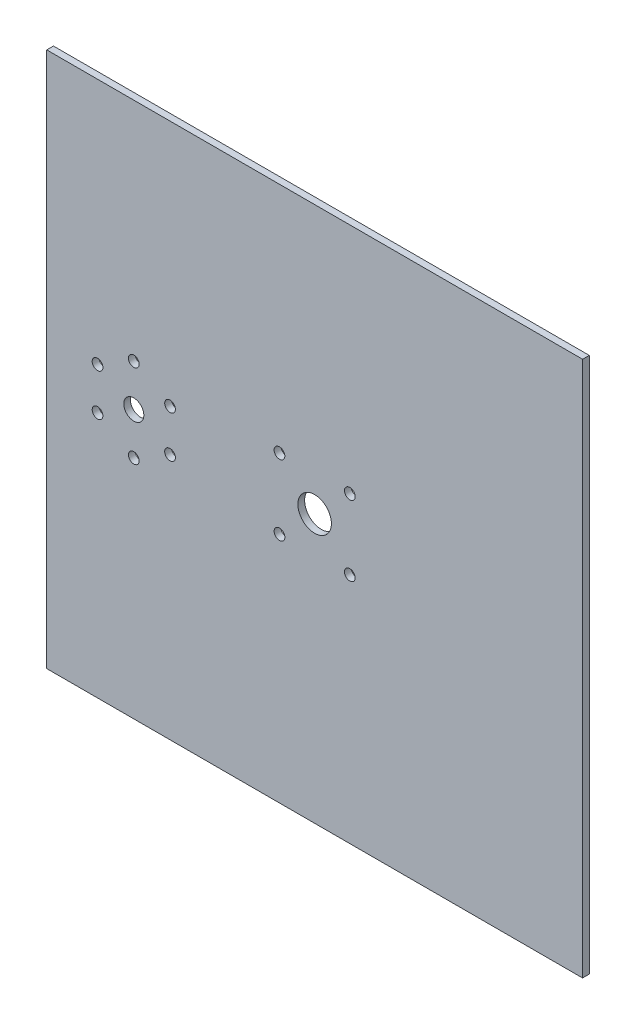
ISO-10303-21;
HEADER;
FILE_DESCRIPTION(('STEP AP214'),'2;1');
FILE_NAME('part.step','',(''),(''),'','','');
FILE_SCHEMA(('AUTOMOTIVE_DESIGN { 1 0 10303 214 1 1 1 1 }'));
ENDSEC;
DATA;
#1=APPLICATION_CONTEXT('core data for automotive mechanical design processes');
#2=APPLICATION_PROTOCOL_DEFINITION('international standard','automotive_design',2000,#1);
#3=PRODUCT_CONTEXT('',#1,'mechanical');
#4=PRODUCT('Part','Part','',(#3));
#5=PRODUCT_RELATED_PRODUCT_CATEGORY('part','',(#4));
#6=PRODUCT_DEFINITION_FORMATION('','',#4);
#7=PRODUCT_DEFINITION_CONTEXT('part definition',#1,'design');
#8=PRODUCT_DEFINITION('design','',#6,#7);
#9=PRODUCT_DEFINITION_SHAPE('','',#8);
#10=(LENGTH_UNIT() NAMED_UNIT(*) SI_UNIT(.MILLI.,.METRE.));
#11=(NAMED_UNIT(*) PLANE_ANGLE_UNIT() SI_UNIT($,.RADIAN.));
#12=(NAMED_UNIT(*) SI_UNIT($,.STERADIAN.) SOLID_ANGLE_UNIT());
#13=UNCERTAINTY_MEASURE_WITH_UNIT(LENGTH_MEASURE(1.E-05),#10,'distance_accuracy_value','');
#14=(GEOMETRIC_REPRESENTATION_CONTEXT(3) GLOBAL_UNCERTAINTY_ASSIGNED_CONTEXT((#13)) GLOBAL_UNIT_ASSIGNED_CONTEXT((#10,
#11,#12)) REPRESENTATION_CONTEXT('',''));
#15=CARTESIAN_POINT('',(0.,0.,0.));
#16=DIRECTION('',(0.,0.,1.));
#17=DIRECTION('',(1.,0.,0.));
#18=AXIS2_PLACEMENT_3D('',#15,#16,#17);
#19=CARTESIAN_POINT('',(-80.,80.,2.));
#20=DIRECTION('',(1.,0.,0.));
#21=DIRECTION('',(0.,0.,-1.));
#22=AXIS2_PLACEMENT_3D('',#19,#20,#21);
#23=PLANE('',#22);
#24=DIRECTION('',(0.,-1.,0.));
#25=VECTOR('',#24,1.);
#26=CARTESIAN_POINT('',(-80.,80.,0.));
#27=LINE('',#26,#25);
#28=CARTESIAN_POINT('',(-80.,80.,0.));
#29=VERTEX_POINT('',#28);
#30=CARTESIAN_POINT('',(-80.,-80.,0.));
#31=VERTEX_POINT('',#30);
#32=EDGE_CURVE('E97',#29,#31,#27,.T.);
#33=ORIENTED_EDGE('',*,*,#32,.T.);
#34=DIRECTION('',(0.,0.,-1.));
#35=VECTOR('',#34,1.);
#36=CARTESIAN_POINT('',(-80.,-80.,2.));
#37=LINE('',#36,#35);
#38=CARTESIAN_POINT('',(-80.,-80.,2.));
#39=VERTEX_POINT('',#38);
#40=EDGE_CURVE('E11',#39,#31,#37,.T.);
#41=ORIENTED_EDGE('',*,*,#40,.F.);
#42=DIRECTION('',(0.,-1.,0.));
#43=VECTOR('',#42,1.);
#44=CARTESIAN_POINT('',(-80.,80.,2.));
#45=LINE('',#44,#43);
#46=CARTESIAN_POINT('',(-80.,80.,2.));
#47=VERTEX_POINT('',#46);
#48=EDGE_CURVE('E85',#47,#39,#45,.T.);
#49=ORIENTED_EDGE('',*,*,#48,.F.);
#50=DIRECTION('',(0.,0.,-1.));
#51=VECTOR('',#50,1.);
#52=CARTESIAN_POINT('',(-80.,80.,2.));
#53=LINE('',#52,#51);
#54=EDGE_CURVE('E93',#47,#29,#53,.T.);
#55=ORIENTED_EDGE('',*,*,#54,.T.);
#56=EDGE_LOOP('',(#33,#41,#49,#55));
#57=FACE_BOUND('',#56,.T.);
#58=ADVANCED_FACE('F34',(#57),#23,.F.);
#59=CARTESIAN_POINT('',(-80.,-80.,2.));
#60=DIRECTION('',(0.,1.,0.));
#61=DIRECTION('',(0.,0.,1.));
#62=AXIS2_PLACEMENT_3D('',#59,#60,#61);
#63=PLANE('',#62);
#64=DIRECTION('',(1.,0.,0.));
#65=VECTOR('',#64,1.);
#66=CARTESIAN_POINT('',(-80.,-80.,0.));
#67=LINE('',#66,#65);
#68=CARTESIAN_POINT('',(80.,-80.,0.));
#69=VERTEX_POINT('',#68);
#70=EDGE_CURVE('E89',#31,#69,#67,.T.);
#71=ORIENTED_EDGE('',*,*,#70,.T.);
#72=DIRECTION('',(0.,0.,-1.));
#73=VECTOR('',#72,1.);
#74=CARTESIAN_POINT('',(80.,-80.,2.));
#75=LINE('',#74,#73);
#76=CARTESIAN_POINT('',(80.,-80.,2.));
#77=VERTEX_POINT('',#76);
#78=EDGE_CURVE('E42',#77,#69,#75,.T.);
#79=ORIENTED_EDGE('',*,*,#78,.F.);
#80=DIRECTION('',(1.,0.,0.));
#81=VECTOR('',#80,1.);
#82=CARTESIAN_POINT('',(-80.,-80.,2.));
#83=LINE('',#82,#81);
#84=EDGE_CURVE('E80',#39,#77,#83,.T.);
#85=ORIENTED_EDGE('',*,*,#84,.F.);
#86=ORIENTED_EDGE('',*,*,#40,.T.);
#87=EDGE_LOOP('',(#71,#79,#85,#86));
#88=FACE_BOUND('',#87,.T.);
#89=ADVANCED_FACE('F88',(#88),#63,.F.);
#90=CARTESIAN_POINT('',(80.,80.,2.));
#91=DIRECTION('',(-1.,0.,0.));
#92=DIRECTION('',(0.,0.,1.));
#93=AXIS2_PLACEMENT_3D('',#90,#91,#92);
#94=PLANE('',#93);
#95=DIRECTION('',(0.,1.,0.));
#96=VECTOR('',#95,1.);
#97=CARTESIAN_POINT('',(80.,80.,0.));
#98=LINE('',#97,#96);
#99=CARTESIAN_POINT('',(80.,80.,0.));
#100=VERTEX_POINT('',#99);
#101=EDGE_CURVE('E67',#69,#100,#98,.T.);
#102=ORIENTED_EDGE('',*,*,#101,.T.);
#103=DIRECTION('',(0.,0.,-1.));
#104=VECTOR('',#103,1.);
#105=CARTESIAN_POINT('',(80.,80.,2.));
#106=LINE('',#105,#104);
#107=CARTESIAN_POINT('',(80.,80.,2.));
#108=VERTEX_POINT('',#107);
#109=EDGE_CURVE('E90',#108,#100,#106,.T.);
#110=ORIENTED_EDGE('',*,*,#109,.F.);
#111=DIRECTION('',(0.,1.,0.));
#112=VECTOR('',#111,1.);
#113=CARTESIAN_POINT('',(80.,80.,2.));
#114=LINE('',#113,#112);
#115=EDGE_CURVE('E83',#77,#108,#114,.T.);
#116=ORIENTED_EDGE('',*,*,#115,.F.);
#117=ORIENTED_EDGE('',*,*,#78,.T.);
#118=EDGE_LOOP('',(#102,#110,#116,#117));
#119=FACE_BOUND('',#118,.T.);
#120=ADVANCED_FACE('F91',(#119),#94,.F.);
#121=CARTESIAN_POINT('',(-80.,80.,2.));
#122=DIRECTION('',(0.,-1.,0.));
#123=DIRECTION('',(0.,0.,-1.));
#124=AXIS2_PLACEMENT_3D('',#121,#122,#123);
#125=PLANE('',#124);
#126=DIRECTION('',(-1.,0.,0.));
#127=VECTOR('',#126,1.);
#128=CARTESIAN_POINT('',(-80.,80.,0.));
#129=LINE('',#128,#127);
#130=EDGE_CURVE('E73',#100,#29,#129,.T.);
#131=ORIENTED_EDGE('',*,*,#130,.T.);
#132=ORIENTED_EDGE('',*,*,#54,.F.);
#133=DIRECTION('',(-1.,0.,0.));
#134=VECTOR('',#133,1.);
#135=CARTESIAN_POINT('',(-80.,80.,2.));
#136=LINE('',#135,#134);
#137=EDGE_CURVE('E50',#108,#47,#136,.T.);
#138=ORIENTED_EDGE('',*,*,#137,.F.);
#139=ORIENTED_EDGE('',*,*,#109,.T.);
#140=EDGE_LOOP('',(#131,#132,#138,#139));
#141=FACE_BOUND('',#140,.T.);
#142=ADVANCED_FACE('F105',(#141),#125,.F.);
#143=CARTESIAN_POINT('',(0.,0.,2.));
#144=DIRECTION('',(0.,0.,1.));
#145=DIRECTION('',(1.,0.,0.));
#146=AXIS2_PLACEMENT_3D('',#143,#144,#145);
#147=PLANE('',#146);
#148=CARTESIAN_POINT('',(-43.1746824526947,6.24999999999957,2.));
#149=DIRECTION('',(0.,0.,-1.));
#150=DIRECTION('',(-1.,0.,0.));
#151=AXIS2_PLACEMENT_3D('',#148,#149,#150);
#152=CIRCLE('',#151,1.6);
#153=CARTESIAN_POINT('',(-44.7746824526947,6.24999999999957,2.));
#154=VERTEX_POINT('',#153);
#155=EDGE_CURVE('E174',#154,#154,#152,.T.);
#156=ORIENTED_EDGE('',*,*,#155,.T.);
#157=EDGE_LOOP('',(#156));
#158=FACE_BOUND('',#157,.T.);
#159=CARTESIAN_POINT('',(-43.1746824526953,-6.25000000000045,2.));
#160=DIRECTION('',(0.,0.,-1.));
#161=DIRECTION('',(-1.,0.,0.));
#162=AXIS2_PLACEMENT_3D('',#159,#160,#161);
#163=CIRCLE('',#162,1.60000000000001);
#164=CARTESIAN_POINT('',(-44.7746824526953,-6.25000000000045,2.));
#165=VERTEX_POINT('',#164);
#166=EDGE_CURVE('E168',#165,#165,#163,.T.);
#167=ORIENTED_EDGE('',*,*,#166,.T.);
#168=EDGE_LOOP('',(#167));
#169=FACE_BOUND('',#168,.T.);
#170=CARTESIAN_POINT('',(-54.000000000001,-12.5,2.));
#171=DIRECTION('',(0.,0.,-1.));
#172=DIRECTION('',(-1.,0.,0.));
#173=AXIS2_PLACEMENT_3D('',#170,#171,#172);
#174=CIRCLE('',#173,1.6);
#175=CARTESIAN_POINT('',(-55.600000000001,-12.5,2.));
#176=VERTEX_POINT('',#175);
#177=EDGE_CURVE('E162',#176,#176,#174,.T.);
#178=ORIENTED_EDGE('',*,*,#177,.T.);
#179=EDGE_LOOP('',(#178));
#180=FACE_BOUND('',#179,.T.);
#181=CARTESIAN_POINT('',(-64.8253175473063,-6.24999999999957,2.));
#182=DIRECTION('',(0.,0.,-1.));
#183=DIRECTION('',(-1.,0.,0.));
#184=AXIS2_PLACEMENT_3D('',#181,#182,#183);
#185=CIRCLE('',#184,1.59999999999999);
#186=CARTESIAN_POINT('',(-66.4253175473063,-6.24999999999957,2.));
#187=VERTEX_POINT('',#186);
#188=EDGE_CURVE('E156',#187,#187,#185,.T.);
#189=ORIENTED_EDGE('',*,*,#188,.T.);
#190=EDGE_LOOP('',(#189));
#191=FACE_BOUND('',#190,.T.);
#192=CARTESIAN_POINT('',(-64.8253175473058,6.25000000000048,2.));
#193=DIRECTION('',(0.,0.,-1.));
#194=DIRECTION('',(-1.,0.,0.));
#195=AXIS2_PLACEMENT_3D('',#192,#193,#194);
#196=CIRCLE('',#195,1.60000000000001);
#197=CARTESIAN_POINT('',(-66.4253175473058,6.25000000000048,2.));
#198=VERTEX_POINT('',#197);
#199=EDGE_CURVE('E150',#198,#198,#196,.T.);
#200=ORIENTED_EDGE('',*,*,#199,.T.);
#201=EDGE_LOOP('',(#200));
#202=FACE_BOUND('',#201,.T.);
#203=CARTESIAN_POINT('',(-54.,12.5,2.));
#204=DIRECTION('',(0.,0.,-1.));
#205=DIRECTION('',(-1.,0.,0.));
#206=AXIS2_PLACEMENT_3D('',#203,#204,#205);
#207=CIRCLE('',#206,1.6);
#208=CARTESIAN_POINT('',(-55.6,12.5,2.));
#209=VERTEX_POINT('',#208);
#210=EDGE_CURVE('E144',#209,#209,#207,.T.);
#211=ORIENTED_EDGE('',*,*,#210,.T.);
#212=EDGE_LOOP('',(#211));
#213=FACE_BOUND('',#212,.T.);
#214=CARTESIAN_POINT('',(-54.,0.,2.));
#215=DIRECTION('',(0.,0.,-1.));
#216=DIRECTION('',(-1.,0.,0.));
#217=AXIS2_PLACEMENT_3D('',#214,#215,#216);
#218=CIRCLE('',#217,3.);
#219=CARTESIAN_POINT('',(-57.,0.,2.));
#220=VERTEX_POINT('',#219);
#221=EDGE_CURVE('E138',#220,#220,#218,.T.);
#222=ORIENTED_EDGE('',*,*,#221,.T.);
#223=EDGE_LOOP('',(#222));
#224=FACE_BOUND('',#223,.T.);
#225=CARTESIAN_POINT('',(10.5,10.4999999999988,2.));
#226=DIRECTION('',(0.,0.,-1.));
#227=DIRECTION('',(-1.,0.,0.));
#228=AXIS2_PLACEMENT_3D('',#225,#226,#227);
#229=CIRCLE('',#228,1.60000000000063);
#230=CARTESIAN_POINT('',(8.89999999999937,10.4999999999988,2.));
#231=VERTEX_POINT('',#230);
#232=EDGE_CURVE('E132',#231,#231,#229,.T.);
#233=ORIENTED_EDGE('',*,*,#232,.T.);
#234=EDGE_LOOP('',(#233));
#235=FACE_BOUND('',#234,.T.);
#236=CARTESIAN_POINT('',(10.4999999999988,-10.5000000000006,2.));
#237=DIRECTION('',(0.,0.,-1.));
#238=DIRECTION('',(-1.,0.,0.));
#239=AXIS2_PLACEMENT_3D('',#236,#237,#238);
#240=CIRCLE('',#239,1.60000000000044);
#241=CARTESIAN_POINT('',(8.89999999999841,-10.5000000000006,2.));
#242=VERTEX_POINT('',#241);
#243=EDGE_CURVE('E126',#242,#242,#240,.T.);
#244=ORIENTED_EDGE('',*,*,#243,.T.);
#245=EDGE_LOOP('',(#244));
#246=FACE_BOUND('',#245,.T.);
#247=CARTESIAN_POINT('',(-10.5000000000006,-10.4999999999994,2.));
#248=DIRECTION('',(0.,0.,-1.));
#249=DIRECTION('',(-1.,0.,0.));
#250=AXIS2_PLACEMENT_3D('',#247,#248,#249);
#251=CIRCLE('',#250,1.59999999999985);
#252=CARTESIAN_POINT('',(-12.1000000000004,-10.4999999999994,2.));
#253=VERTEX_POINT('',#252);
#254=EDGE_CURVE('E120',#253,#253,#251,.T.);
#255=ORIENTED_EDGE('',*,*,#254,.T.);
#256=EDGE_LOOP('',(#255));
#257=FACE_BOUND('',#256,.T.);
#258=CARTESIAN_POINT('',(-10.4999999999994,10.5,2.));
#259=DIRECTION('',(0.,0.,-1.));
#260=DIRECTION('',(-1.,0.,0.));
#261=AXIS2_PLACEMENT_3D('',#258,#259,#260);
#262=CIRCLE('',#261,1.6);
#263=CARTESIAN_POINT('',(-12.0999999999994,10.5,2.));
#264=VERTEX_POINT('',#263);
#265=EDGE_CURVE('E114',#264,#264,#262,.T.);
#266=ORIENTED_EDGE('',*,*,#265,.T.);
#267=EDGE_LOOP('',(#266));
#268=FACE_BOUND('',#267,.T.);
#269=CARTESIAN_POINT('',(0.,0.,2.));
#270=DIRECTION('',(0.,0.,1.));
#271=DIRECTION('',(1.,0.,0.));
#272=AXIS2_PLACEMENT_3D('',#269,#270,#271);
#273=CIRCLE('',#272,5.);
#274=CARTESIAN_POINT('',(5.,0.,2.));
#275=VERTEX_POINT('',#274);
#276=EDGE_CURVE('E111',#275,#275,#273,.T.);
#277=ORIENTED_EDGE('',*,*,#276,.F.);
#278=EDGE_LOOP('',(#277));
#279=FACE_BOUND('',#278,.T.);
#280=ORIENTED_EDGE('',*,*,#48,.T.);
#281=ORIENTED_EDGE('',*,*,#84,.T.);
#282=ORIENTED_EDGE('',*,*,#115,.T.);
#283=ORIENTED_EDGE('',*,*,#137,.T.);
#284=EDGE_LOOP('',(#280,#281,#282,#283));
#285=FACE_BOUND('',#284,.T.);
#286=ADVANCED_FACE('F81',(#158,#169,#180,#191,#202,#213,#224,#235,#246,#257,#268,#279,#285),
#147,.T.);
#287=CARTESIAN_POINT('',(0.,0.,0.));
#288=DIRECTION('',(0.,0.,1.));
#289=DIRECTION('',(1.,0.,0.));
#290=AXIS2_PLACEMENT_3D('',#287,#288,#289);
#291=PLANE('',#290);
#292=CARTESIAN_POINT('',(-43.1746824526947,6.24999999999957,0.));
#293=DIRECTION('',(0.,0.,-1.));
#294=DIRECTION('',(-1.,0.,0.));
#295=AXIS2_PLACEMENT_3D('',#292,#293,#294);
#296=CIRCLE('',#295,1.6);
#297=CARTESIAN_POINT('',(-44.7746824526947,6.24999999999957,0.));
#298=VERTEX_POINT('',#297);
#299=EDGE_CURVE('E177',#298,#298,#296,.T.);
#300=ORIENTED_EDGE('',*,*,#299,.F.);
#301=EDGE_LOOP('',(#300));
#302=FACE_BOUND('',#301,.T.);
#303=CARTESIAN_POINT('',(-43.1746824526953,-6.25000000000045,0.));
#304=DIRECTION('',(0.,0.,-1.));
#305=DIRECTION('',(-1.,0.,0.));
#306=AXIS2_PLACEMENT_3D('',#303,#304,#305);
#307=CIRCLE('',#306,1.60000000000001);
#308=CARTESIAN_POINT('',(-44.7746824526953,-6.25000000000045,0.));
#309=VERTEX_POINT('',#308);
#310=EDGE_CURVE('E171',#309,#309,#307,.T.);
#311=ORIENTED_EDGE('',*,*,#310,.F.);
#312=EDGE_LOOP('',(#311));
#313=FACE_BOUND('',#312,.T.);
#314=CARTESIAN_POINT('',(-54.000000000001,-12.5,0.));
#315=DIRECTION('',(0.,0.,-1.));
#316=DIRECTION('',(-1.,0.,0.));
#317=AXIS2_PLACEMENT_3D('',#314,#315,#316);
#318=CIRCLE('',#317,1.6);
#319=CARTESIAN_POINT('',(-55.600000000001,-12.5,0.));
#320=VERTEX_POINT('',#319);
#321=EDGE_CURVE('E165',#320,#320,#318,.T.);
#322=ORIENTED_EDGE('',*,*,#321,.F.);
#323=EDGE_LOOP('',(#322));
#324=FACE_BOUND('',#323,.T.);
#325=CARTESIAN_POINT('',(-64.8253175473063,-6.24999999999957,0.));
#326=DIRECTION('',(0.,0.,-1.));
#327=DIRECTION('',(-1.,0.,0.));
#328=AXIS2_PLACEMENT_3D('',#325,#326,#327);
#329=CIRCLE('',#328,1.59999999999999);
#330=CARTESIAN_POINT('',(-66.4253175473063,-6.24999999999957,0.));
#331=VERTEX_POINT('',#330);
#332=EDGE_CURVE('E159',#331,#331,#329,.T.);
#333=ORIENTED_EDGE('',*,*,#332,.F.);
#334=EDGE_LOOP('',(#333));
#335=FACE_BOUND('',#334,.T.);
#336=CARTESIAN_POINT('',(-64.8253175473058,6.25000000000048,0.));
#337=DIRECTION('',(0.,0.,-1.));
#338=DIRECTION('',(-1.,0.,0.));
#339=AXIS2_PLACEMENT_3D('',#336,#337,#338);
#340=CIRCLE('',#339,1.60000000000001);
#341=CARTESIAN_POINT('',(-66.4253175473058,6.25000000000048,0.));
#342=VERTEX_POINT('',#341);
#343=EDGE_CURVE('E153',#342,#342,#340,.T.);
#344=ORIENTED_EDGE('',*,*,#343,.F.);
#345=EDGE_LOOP('',(#344));
#346=FACE_BOUND('',#345,.T.);
#347=CARTESIAN_POINT('',(-54.,12.5,0.));
#348=DIRECTION('',(0.,0.,-1.));
#349=DIRECTION('',(-1.,0.,0.));
#350=AXIS2_PLACEMENT_3D('',#347,#348,#349);
#351=CIRCLE('',#350,1.6);
#352=CARTESIAN_POINT('',(-55.6,12.5,0.));
#353=VERTEX_POINT('',#352);
#354=EDGE_CURVE('E147',#353,#353,#351,.T.);
#355=ORIENTED_EDGE('',*,*,#354,.F.);
#356=EDGE_LOOP('',(#355));
#357=FACE_BOUND('',#356,.T.);
#358=CARTESIAN_POINT('',(-54.,0.,0.));
#359=DIRECTION('',(0.,0.,-1.));
#360=DIRECTION('',(-1.,0.,0.));
#361=AXIS2_PLACEMENT_3D('',#358,#359,#360);
#362=CIRCLE('',#361,3.);
#363=CARTESIAN_POINT('',(-57.,0.,0.));
#364=VERTEX_POINT('',#363);
#365=EDGE_CURVE('E141',#364,#364,#362,.T.);
#366=ORIENTED_EDGE('',*,*,#365,.F.);
#367=EDGE_LOOP('',(#366));
#368=FACE_BOUND('',#367,.T.);
#369=CARTESIAN_POINT('',(10.5,10.4999999999988,0.));
#370=DIRECTION('',(0.,0.,-1.));
#371=DIRECTION('',(-1.,0.,0.));
#372=AXIS2_PLACEMENT_3D('',#369,#370,#371);
#373=CIRCLE('',#372,1.60000000000063);
#374=CARTESIAN_POINT('',(8.89999999999937,10.4999999999988,0.));
#375=VERTEX_POINT('',#374);
#376=EDGE_CURVE('E135',#375,#375,#373,.T.);
#377=ORIENTED_EDGE('',*,*,#376,.F.);
#378=EDGE_LOOP('',(#377));
#379=FACE_BOUND('',#378,.T.);
#380=CARTESIAN_POINT('',(10.4999999999988,-10.5000000000006,0.));
#381=DIRECTION('',(0.,0.,-1.));
#382=DIRECTION('',(-1.,0.,0.));
#383=AXIS2_PLACEMENT_3D('',#380,#381,#382);
#384=CIRCLE('',#383,1.60000000000044);
#385=CARTESIAN_POINT('',(8.89999999999841,-10.5000000000006,0.));
#386=VERTEX_POINT('',#385);
#387=EDGE_CURVE('E129',#386,#386,#384,.T.);
#388=ORIENTED_EDGE('',*,*,#387,.F.);
#389=EDGE_LOOP('',(#388));
#390=FACE_BOUND('',#389,.T.);
#391=CARTESIAN_POINT('',(-10.5000000000006,-10.4999999999994,0.));
#392=DIRECTION('',(0.,0.,-1.));
#393=DIRECTION('',(-1.,0.,0.));
#394=AXIS2_PLACEMENT_3D('',#391,#392,#393);
#395=CIRCLE('',#394,1.59999999999985);
#396=CARTESIAN_POINT('',(-12.1000000000004,-10.4999999999994,0.));
#397=VERTEX_POINT('',#396);
#398=EDGE_CURVE('E123',#397,#397,#395,.T.);
#399=ORIENTED_EDGE('',*,*,#398,.F.);
#400=EDGE_LOOP('',(#399));
#401=FACE_BOUND('',#400,.T.);
#402=CARTESIAN_POINT('',(-10.4999999999994,10.5,0.));
#403=DIRECTION('',(0.,0.,-1.));
#404=DIRECTION('',(-1.,0.,0.));
#405=AXIS2_PLACEMENT_3D('',#402,#403,#404);
#406=CIRCLE('',#405,1.6);
#407=CARTESIAN_POINT('',(-12.0999999999994,10.5,0.));
#408=VERTEX_POINT('',#407);
#409=EDGE_CURVE('E117',#408,#408,#406,.T.);
#410=ORIENTED_EDGE('',*,*,#409,.F.);
#411=EDGE_LOOP('',(#410));
#412=FACE_BOUND('',#411,.T.);
#413=CARTESIAN_POINT('',(0.,0.,0.));
#414=DIRECTION('',(0.,0.,1.));
#415=DIRECTION('',(1.,0.,0.));
#416=AXIS2_PLACEMENT_3D('',#413,#414,#415);
#417=CIRCLE('',#416,5.);
#418=CARTESIAN_POINT('',(5.,0.,0.));
#419=VERTEX_POINT('',#418);
#420=EDGE_CURVE('E100',#419,#419,#417,.T.);
#421=ORIENTED_EDGE('',*,*,#420,.T.);
#422=EDGE_LOOP('',(#421));
#423=FACE_BOUND('',#422,.T.);
#424=ORIENTED_EDGE('',*,*,#32,.F.);
#425=ORIENTED_EDGE('',*,*,#130,.F.);
#426=ORIENTED_EDGE('',*,*,#101,.F.);
#427=ORIENTED_EDGE('',*,*,#70,.F.);
#428=EDGE_LOOP('',(#424,#425,#426,#427));
#429=FACE_BOUND('',#428,.T.);
#430=ADVANCED_FACE('F108',(#302,#313,#324,#335,#346,#357,#368,#379,#390,#401,#412,#423,#429),
#291,.F.);
#431=CARTESIAN_POINT('',(0.,0.,0.));
#432=DIRECTION('',(0.,0.,1.));
#433=DIRECTION('',(1.,0.,0.));
#434=AXIS2_PLACEMENT_3D('',#431,#432,#433);
#435=CYLINDRICAL_SURFACE('',#434,5.);
#436=ORIENTED_EDGE('',*,*,#420,.F.);
#437=EDGE_LOOP('',(#436));
#438=FACE_BOUND('',#437,.T.);
#439=ORIENTED_EDGE('',*,*,#276,.T.);
#440=EDGE_LOOP('',(#439));
#441=FACE_BOUND('',#440,.T.);
#442=ADVANCED_FACE('F194',(#438,#441),#435,.F.);
#443=CARTESIAN_POINT('',(-10.4999999999994,10.5,2.));
#444=DIRECTION('',(0.,0.,-1.));
#445=DIRECTION('',(-1.,0.,0.));
#446=AXIS2_PLACEMENT_3D('',#443,#444,#445);
#447=CYLINDRICAL_SURFACE('',#446,1.6);
#448=ORIENTED_EDGE('',*,*,#265,.F.);
#449=EDGE_LOOP('',(#448));
#450=FACE_BOUND('',#449,.T.);
#451=ORIENTED_EDGE('',*,*,#409,.T.);
#452=EDGE_LOOP('',(#451));
#453=FACE_BOUND('',#452,.T.);
#454=ADVANCED_FACE('F220',(#450,#453),#447,.F.);
#455=CARTESIAN_POINT('',(-10.5000000000006,-10.4999999999994,2.));
#456=DIRECTION('',(0.,0.,-1.));
#457=DIRECTION('',(-1.,0.,0.));
#458=AXIS2_PLACEMENT_3D('',#455,#456,#457);
#459=CYLINDRICAL_SURFACE('',#458,1.59999999999985);
#460=ORIENTED_EDGE('',*,*,#254,.F.);
#461=EDGE_LOOP('',(#460));
#462=FACE_BOUND('',#461,.T.);
#463=ORIENTED_EDGE('',*,*,#398,.T.);
#464=EDGE_LOOP('',(#463));
#465=FACE_BOUND('',#464,.T.);
#466=ADVANCED_FACE('F261',(#462,#465),#459,.F.);
#467=CARTESIAN_POINT('',(10.4999999999988,-10.5000000000006,2.));
#468=DIRECTION('',(0.,0.,-1.));
#469=DIRECTION('',(-1.,0.,0.));
#470=AXIS2_PLACEMENT_3D('',#467,#468,#469);
#471=CYLINDRICAL_SURFACE('',#470,1.60000000000044);
#472=ORIENTED_EDGE('',*,*,#243,.F.);
#473=EDGE_LOOP('',(#472));
#474=FACE_BOUND('',#473,.T.);
#475=ORIENTED_EDGE('',*,*,#387,.T.);
#476=EDGE_LOOP('',(#475));
#477=FACE_BOUND('',#476,.T.);
#478=ADVANCED_FACE('F271',(#474,#477),#471,.F.);
#479=CARTESIAN_POINT('',(10.5,10.4999999999988,2.));
#480=DIRECTION('',(0.,0.,-1.));
#481=DIRECTION('',(-1.,0.,0.));
#482=AXIS2_PLACEMENT_3D('',#479,#480,#481);
#483=CYLINDRICAL_SURFACE('',#482,1.60000000000063);
#484=ORIENTED_EDGE('',*,*,#232,.F.);
#485=EDGE_LOOP('',(#484));
#486=FACE_BOUND('',#485,.T.);
#487=ORIENTED_EDGE('',*,*,#376,.T.);
#488=EDGE_LOOP('',(#487));
#489=FACE_BOUND('',#488,.T.);
#490=ADVANCED_FACE('F281',(#486,#489),#483,.F.);
#491=CARTESIAN_POINT('',(-54.,0.,2.));
#492=DIRECTION('',(0.,0.,-1.));
#493=DIRECTION('',(-1.,0.,0.));
#494=AXIS2_PLACEMENT_3D('',#491,#492,#493);
#495=CYLINDRICAL_SURFACE('',#494,3.);
#496=ORIENTED_EDGE('',*,*,#221,.F.);
#497=EDGE_LOOP('',(#496));
#498=FACE_BOUND('',#497,.T.);
#499=ORIENTED_EDGE('',*,*,#365,.T.);
#500=EDGE_LOOP('',(#499));
#501=FACE_BOUND('',#500,.T.);
#502=ADVANCED_FACE('F290',(#498,#501),#495,.F.);
#503=CARTESIAN_POINT('',(-54.,12.5,2.));
#504=DIRECTION('',(0.,0.,-1.));
#505=DIRECTION('',(-1.,0.,0.));
#506=AXIS2_PLACEMENT_3D('',#503,#504,#505);
#507=CYLINDRICAL_SURFACE('',#506,1.6);
#508=ORIENTED_EDGE('',*,*,#210,.F.);
#509=EDGE_LOOP('',(#508));
#510=FACE_BOUND('',#509,.T.);
#511=ORIENTED_EDGE('',*,*,#354,.T.);
#512=EDGE_LOOP('',(#511));
#513=FACE_BOUND('',#512,.T.);
#514=ADVANCED_FACE('F309',(#510,#513),#507,.F.);
#515=CARTESIAN_POINT('',(-64.8253175473058,6.25000000000048,2.));
#516=DIRECTION('',(0.,0.,-1.));
#517=DIRECTION('',(-1.,0.,0.));
#518=AXIS2_PLACEMENT_3D('',#515,#516,#517);
#519=CYLINDRICAL_SURFACE('',#518,1.60000000000001);
#520=ORIENTED_EDGE('',*,*,#199,.F.);
#521=EDGE_LOOP('',(#520));
#522=FACE_BOUND('',#521,.T.);
#523=ORIENTED_EDGE('',*,*,#343,.T.);
#524=EDGE_LOOP('',(#523));
#525=FACE_BOUND('',#524,.T.);
#526=ADVANCED_FACE('F319',(#522,#525),#519,.F.);
#527=CARTESIAN_POINT('',(-64.8253175473063,-6.24999999999957,2.));
#528=DIRECTION('',(0.,0.,-1.));
#529=DIRECTION('',(-1.,0.,0.));
#530=AXIS2_PLACEMENT_3D('',#527,#528,#529);
#531=CYLINDRICAL_SURFACE('',#530,1.59999999999999);
#532=ORIENTED_EDGE('',*,*,#188,.F.);
#533=EDGE_LOOP('',(#532));
#534=FACE_BOUND('',#533,.T.);
#535=ORIENTED_EDGE('',*,*,#332,.T.);
#536=EDGE_LOOP('',(#535));
#537=FACE_BOUND('',#536,.T.);
#538=ADVANCED_FACE('F329',(#534,#537),#531,.F.);
#539=CARTESIAN_POINT('',(-54.000000000001,-12.5,2.));
#540=DIRECTION('',(0.,0.,-1.));
#541=DIRECTION('',(-1.,0.,0.));
#542=AXIS2_PLACEMENT_3D('',#539,#540,#541);
#543=CYLINDRICAL_SURFACE('',#542,1.6);
#544=ORIENTED_EDGE('',*,*,#177,.F.);
#545=EDGE_LOOP('',(#544));
#546=FACE_BOUND('',#545,.T.);
#547=ORIENTED_EDGE('',*,*,#321,.T.);
#548=EDGE_LOOP('',(#547));
#549=FACE_BOUND('',#548,.T.);
#550=ADVANCED_FACE('F339',(#546,#549),#543,.F.);
#551=CARTESIAN_POINT('',(-43.1746824526953,-6.25000000000045,2.));
#552=DIRECTION('',(0.,0.,-1.));
#553=DIRECTION('',(-1.,0.,0.));
#554=AXIS2_PLACEMENT_3D('',#551,#552,#553);
#555=CYLINDRICAL_SURFACE('',#554,1.60000000000001);
#556=ORIENTED_EDGE('',*,*,#166,.F.);
#557=EDGE_LOOP('',(#556));
#558=FACE_BOUND('',#557,.T.);
#559=ORIENTED_EDGE('',*,*,#310,.T.);
#560=EDGE_LOOP('',(#559));
#561=FACE_BOUND('',#560,.T.);
#562=ADVANCED_FACE('F188',(#558,#561),#555,.F.);
#563=CARTESIAN_POINT('',(-43.1746824526947,6.24999999999957,2.));
#564=DIRECTION('',(0.,0.,-1.));
#565=DIRECTION('',(-1.,0.,0.));
#566=AXIS2_PLACEMENT_3D('',#563,#564,#565);
#567=CYLINDRICAL_SURFACE('',#566,1.6);
#568=ORIENTED_EDGE('',*,*,#155,.F.);
#569=EDGE_LOOP('',(#568));
#570=FACE_BOUND('',#569,.T.);
#571=ORIENTED_EDGE('',*,*,#299,.T.);
#572=EDGE_LOOP('',(#571));
#573=FACE_BOUND('',#572,.T.);
#574=ADVANCED_FACE('F185',(#570,#573),#567,.F.);
#575=CLOSED_SHELL('',(#58,#89,#120,#142,#286,#430,#442,#454,#466,#478,#490,#502,#514,#526,#538,
#550,#562,#574));
#576=MANIFOLD_SOLID_BREP('B2',#575);
#577=ADVANCED_BREP_SHAPE_REPRESENTATION('',(#18,#576),#14);
#578=SHAPE_DEFINITION_REPRESENTATION(#9,#577);
ENDSEC;
END-ISO-10303-21;
